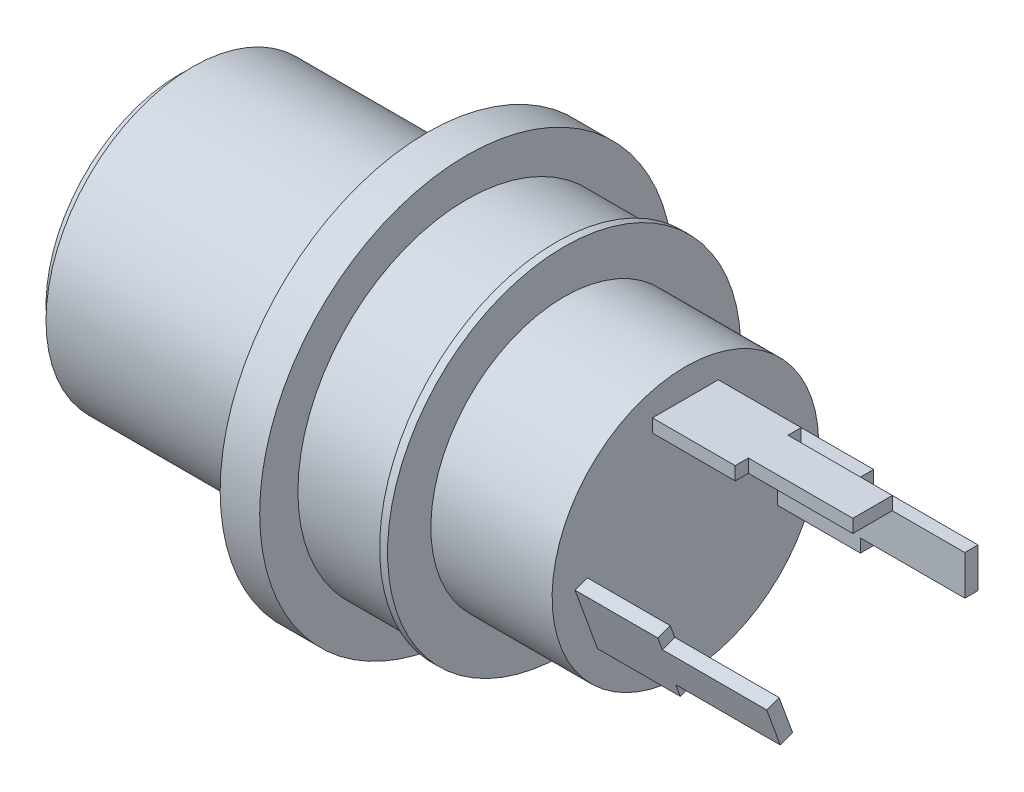
ISO-10303-21;
HEADER;
FILE_DESCRIPTION(('STEP AP214'),'2;1');
FILE_NAME('part.step','',(''),(''),'','','');
FILE_SCHEMA(('AUTOMOTIVE_DESIGN { 1 0 10303 214 1 1 1 1 }'));
ENDSEC;
DATA;
#1=APPLICATION_CONTEXT('core data for automotive mechanical design processes');
#2=APPLICATION_PROTOCOL_DEFINITION('international standard','automotive_design',2000,#1);
#3=PRODUCT_CONTEXT('',#1,'mechanical');
#4=PRODUCT('Part','Part','',(#3));
#5=PRODUCT_RELATED_PRODUCT_CATEGORY('part','',(#4));
#6=PRODUCT_DEFINITION_FORMATION('','',#4);
#7=PRODUCT_DEFINITION_CONTEXT('part definition',#1,'design');
#8=PRODUCT_DEFINITION('design','',#6,#7);
#9=PRODUCT_DEFINITION_SHAPE('','',#8);
#10=(LENGTH_UNIT() NAMED_UNIT(*) SI_UNIT(.MILLI.,.METRE.));
#11=(NAMED_UNIT(*) PLANE_ANGLE_UNIT() SI_UNIT($,.RADIAN.));
#12=(NAMED_UNIT(*) SI_UNIT($,.STERADIAN.) SOLID_ANGLE_UNIT());
#13=UNCERTAINTY_MEASURE_WITH_UNIT(LENGTH_MEASURE(1.E-05),#10,'distance_accuracy_value','');
#14=(GEOMETRIC_REPRESENTATION_CONTEXT(3) GLOBAL_UNCERTAINTY_ASSIGNED_CONTEXT((#13)) GLOBAL_UNIT_ASSIGNED_CONTEXT((#10,
#11,#12)) REPRESENTATION_CONTEXT('',''));
#15=CARTESIAN_POINT('',(0.,0.,0.));
#16=DIRECTION('',(0.,0.,1.));
#17=DIRECTION('',(1.,0.,0.));
#18=AXIS2_PLACEMENT_3D('',#15,#16,#17);
#19=CARTESIAN_POINT('',(36.2472739636741,4.,-1.25));
#20=DIRECTION('',(0.,0.,-1.));
#21=DIRECTION('',(-1.,0.,0.));
#22=AXIS2_PLACEMENT_3D('',#19,#20,#21);
#23=PLANE('',#22);
#24=DIRECTION('',(-1.,0.,0.));
#25=VECTOR('',#24,1.);
#26=CARTESIAN_POINT('',(36.2472739636741,4.,-1.25));
#27=LINE('',#26,#25);
#28=CARTESIAN_POINT('',(3.14,4.,-1.25));
#29=VERTEX_POINT('',#28);
#30=CARTESIAN_POINT('',(0.,4.,-1.25));
#31=VERTEX_POINT('',#30);
#32=EDGE_CURVE('E214',#29,#31,#27,.T.);
#33=ORIENTED_EDGE('',*,*,#32,.F.);
#34=DIRECTION('',(0.,1.,0.));
#35=VECTOR('',#34,1.);
#36=CARTESIAN_POINT('',(3.14,3.5,-1.25));
#37=LINE('',#36,#35);
#38=CARTESIAN_POINT('',(3.14,3.5,-1.25));
#39=VERTEX_POINT('',#38);
#40=EDGE_CURVE('E199',#39,#29,#37,.T.);
#41=ORIENTED_EDGE('',*,*,#40,.F.);
#42=DIRECTION('',(-1.,0.,0.));
#43=VECTOR('',#42,1.);
#44=CARTESIAN_POINT('',(36.2472739636741,3.5,-1.25));
#45=LINE('',#44,#43);
#46=CARTESIAN_POINT('',(0.,3.5,-1.25));
#47=VERTEX_POINT('',#46);
#48=EDGE_CURVE('E222',#39,#47,#45,.T.);
#49=ORIENTED_EDGE('',*,*,#48,.T.);
#50=DIRECTION('',(0.,-1.,0.));
#51=VECTOR('',#50,1.);
#52=CARTESIAN_POINT('',(0.,4.,-1.25));
#53=LINE('',#52,#51);
#54=EDGE_CURVE('E221',#31,#47,#53,.T.);
#55=ORIENTED_EDGE('',*,*,#54,.F.);
#56=EDGE_LOOP('',(#33,#41,#49,#55));
#57=FACE_BOUND('',#56,.T.);
#58=ADVANCED_FACE('F38',(#57),#23,.T.);
#59=CARTESIAN_POINT('',(36.2472739636741,3.5,1.25));
#60=DIRECTION('',(0.,0.,1.));
#61=DIRECTION('',(1.,0.,0.));
#62=AXIS2_PLACEMENT_3D('',#59,#60,#61);
#63=PLANE('',#62);
#64=DIRECTION('',(-1.,0.,0.));
#65=VECTOR('',#64,1.);
#66=CARTESIAN_POINT('',(36.2472739636741,3.5,1.25));
#67=LINE('',#66,#65);
#68=CARTESIAN_POINT('',(3.14,3.5,1.25));
#69=VERTEX_POINT('',#68);
#70=CARTESIAN_POINT('',(0.,3.5,1.25));
#71=VERTEX_POINT('',#70);
#72=EDGE_CURVE('E227',#69,#71,#67,.T.);
#73=ORIENTED_EDGE('',*,*,#72,.F.);
#74=DIRECTION('',(0.,-1.,0.));
#75=VECTOR('',#74,1.);
#76=CARTESIAN_POINT('',(3.14,4.,1.25));
#77=LINE('',#76,#75);
#78=CARTESIAN_POINT('',(3.14,4.,1.25));
#79=VERTEX_POINT('',#78);
#80=EDGE_CURVE('E457',#79,#69,#77,.T.);
#81=ORIENTED_EDGE('',*,*,#80,.F.);
#82=DIRECTION('',(-1.,0.,0.));
#83=VECTOR('',#82,1.);
#84=CARTESIAN_POINT('',(36.2472739636741,4.,1.25));
#85=LINE('',#84,#83);
#86=CARTESIAN_POINT('',(0.,4.,1.25));
#87=VERTEX_POINT('',#86);
#88=EDGE_CURVE('E223',#79,#87,#85,.T.);
#89=ORIENTED_EDGE('',*,*,#88,.T.);
#90=DIRECTION('',(0.,1.,0.));
#91=VECTOR('',#90,1.);
#92=CARTESIAN_POINT('',(0.,3.5,1.25));
#93=LINE('',#92,#91);
#94=EDGE_CURVE('E448',#71,#87,#93,.T.);
#95=ORIENTED_EDGE('',*,*,#94,.F.);
#96=EDGE_LOOP('',(#73,#81,#89,#95));
#97=FACE_BOUND('',#96,.T.);
#98=ADVANCED_FACE('F285',(#97),#63,.T.);
#99=CARTESIAN_POINT('',(36.2472739636741,1.25,-3.5));
#100=DIRECTION('',(0.,1.,0.));
#101=DIRECTION('',(-1.,0.,0.));
#102=AXIS2_PLACEMENT_3D('',#99,#100,#101);
#103=PLANE('',#102);
#104=DIRECTION('',(-1.,0.,0.));
#105=VECTOR('',#104,1.);
#106=CARTESIAN_POINT('',(36.2472739636741,1.25,-3.5));
#107=LINE('',#106,#105);
#108=CARTESIAN_POINT('',(3.14,1.25,-3.5));
#109=VERTEX_POINT('',#108);
#110=CARTESIAN_POINT('',(0.,1.25,-3.5));
#111=VERTEX_POINT('',#110);
#112=EDGE_CURVE('E433',#109,#111,#107,.T.);
#113=ORIENTED_EDGE('',*,*,#112,.F.);
#114=DIRECTION('',(0.,0.,1.));
#115=VECTOR('',#114,1.);
#116=CARTESIAN_POINT('',(3.14,1.25,-3.5));
#117=LINE('',#116,#115);
#118=CARTESIAN_POINT('',(3.14,1.25,-4.));
#119=VERTEX_POINT('',#118);
#120=EDGE_CURVE('E818',#119,#109,#117,.T.);
#121=ORIENTED_EDGE('',*,*,#120,.F.);
#122=DIRECTION('',(-1.,0.,0.));
#123=VECTOR('',#122,1.);
#124=CARTESIAN_POINT('',(36.2472739636741,1.25,-4.));
#125=LINE('',#124,#123);
#126=CARTESIAN_POINT('',(0.,1.25,-4.));
#127=VERTEX_POINT('',#126);
#128=EDGE_CURVE('E435',#119,#127,#125,.T.);
#129=ORIENTED_EDGE('',*,*,#128,.T.);
#130=DIRECTION('',(0.,0.,-1.));
#131=VECTOR('',#130,1.);
#132=CARTESIAN_POINT('',(0.,1.25,-3.5));
#133=LINE('',#132,#131);
#134=EDGE_CURVE('E430',#111,#127,#133,.T.);
#135=ORIENTED_EDGE('',*,*,#134,.F.);
#136=EDGE_LOOP('',(#113,#121,#129,#135));
#137=FACE_BOUND('',#136,.T.);
#138=ADVANCED_FACE('F290',(#137),#103,.T.);
#139=CARTESIAN_POINT('',(0.,5.05625,0.));
#140=DIRECTION('',(1.,0.,0.));
#141=DIRECTION('',(0.,1.,0.));
#142=AXIS2_PLACEMENT_3D('',#139,#140,#141);
#143=PLANE('',#142);
#144=CARTESIAN_POINT('',(0.,0.,0.));
#145=DIRECTION('',(1.,0.,0.));
#146=DIRECTION('',(0.,1.,0.));
#147=AXIS2_PLACEMENT_3D('',#144,#145,#146);
#148=CIRCLE('',#147,5.05625);
#149=CARTESIAN_POINT('',(0.,5.05625,0.));
#150=VERTEX_POINT('',#149);
#151=EDGE_CURVE('E238',#150,#150,#148,.T.);
#152=ORIENTED_EDGE('',*,*,#151,.T.);
#153=EDGE_LOOP('',(#152));
#154=FACE_BOUND('',#153,.T.);
#155=ORIENTED_EDGE('',*,*,#54,.T.);
#156=DIRECTION('',(0.,0.,-1.));
#157=VECTOR('',#156,1.);
#158=CARTESIAN_POINT('',(0.,3.5,1.25));
#159=LINE('',#158,#157);
#160=EDGE_CURVE('E424',#71,#47,#159,.T.);
#161=ORIENTED_EDGE('',*,*,#160,.F.);
#162=ORIENTED_EDGE('',*,*,#94,.T.);
#163=DIRECTION('',(0.,0.,-1.));
#164=VECTOR('',#163,1.);
#165=CARTESIAN_POINT('',(0.,4.,1.25));
#166=LINE('',#165,#164);
#167=EDGE_CURVE('E446',#87,#31,#166,.T.);
#168=ORIENTED_EDGE('',*,*,#167,.T.);
#169=EDGE_LOOP('',(#155,#161,#162,#168));
#170=FACE_BOUND('',#169,.T.);
#171=DIRECTION('',(0.,0.,1.));
#172=VECTOR('',#171,1.);
#173=CARTESIAN_POINT('',(0.,-1.25,-4.));
#174=LINE('',#173,#172);
#175=CARTESIAN_POINT('',(0.,-1.25,-4.));
#176=VERTEX_POINT('',#175);
#177=CARTESIAN_POINT('',(0.,-1.25,-3.5));
#178=VERTEX_POINT('',#177);
#179=EDGE_CURVE('E374',#176,#178,#174,.T.);
#180=ORIENTED_EDGE('',*,*,#179,.T.);
#181=DIRECTION('',(0.,1.,0.));
#182=VECTOR('',#181,1.);
#183=CARTESIAN_POINT('',(0.,1.25,-3.5));
#184=LINE('',#183,#182);
#185=EDGE_CURVE('E425',#111,#178,#184,.F.);
#186=ORIENTED_EDGE('',*,*,#185,.F.);
#187=ORIENTED_EDGE('',*,*,#134,.T.);
#188=DIRECTION('',(0.,1.,0.));
#189=VECTOR('',#188,1.);
#190=CARTESIAN_POINT('',(0.,1.25,-4.));
#191=LINE('',#190,#189);
#192=EDGE_CURVE('E428',#127,#176,#191,.F.);
#193=ORIENTED_EDGE('',*,*,#192,.T.);
#194=EDGE_LOOP('',(#180,#186,#187,#193));
#195=FACE_BOUND('',#194,.T.);
#196=DIRECTION('',(0.,-0.342020143325662,0.939692620785911));
#197=VECTOR('',#196,1.);
#198=CARTESIAN_POINT('',(0.,-2.37168627762221,2.86139899359361));
#199=LINE('',#198,#197);
#200=CARTESIAN_POINT('',(0.,-2.37168627762221,2.86139899359361));
#201=VERTEX_POINT('',#200);
#202=CARTESIAN_POINT('',(0.,-2.54269634928504,3.33124530398656));
#203=VERTEX_POINT('',#202);
#204=EDGE_CURVE('E380',#201,#203,#199,.T.);
#205=ORIENTED_EDGE('',*,*,#204,.T.);
#206=DIRECTION('',(0.,-0.939692620785911,-0.342020143325663));
#207=VECTOR('',#206,1.);
#208=CARTESIAN_POINT('',(0.,-0.193464797320264,4.18629566230072));
#209=LINE('',#208,#207);
#210=CARTESIAN_POINT('',(0.,-0.193464797320264,4.18629566230072));
#211=VERTEX_POINT('',#210);
#212=EDGE_CURVE('E383',#211,#203,#209,.T.);
#213=ORIENTED_EDGE('',*,*,#212,.F.);
#214=DIRECTION('',(0.,0.342020143325663,-0.939692620785911));
#215=VECTOR('',#214,1.);
#216=CARTESIAN_POINT('',(0.,-0.193464797320264,4.18629566230072));
#217=LINE('',#216,#215);
#218=CARTESIAN_POINT('',(0.,-0.0224547256574331,3.71644935190777));
#219=VERTEX_POINT('',#218);
#220=EDGE_CURVE('E408',#211,#219,#217,.T.);
#221=ORIENTED_EDGE('',*,*,#220,.T.);
#222=DIRECTION('',(0.,-0.939692620785911,-0.342020143325663));
#223=VECTOR('',#222,1.);
#224=CARTESIAN_POINT('',(0.,-0.0224547256574327,3.71644935190777));
#225=LINE('',#224,#223);
#226=EDGE_CURVE('E386',#219,#201,#225,.T.);
#227=ORIENTED_EDGE('',*,*,#226,.T.);
#228=EDGE_LOOP('',(#205,#213,#221,#227));
#229=FACE_BOUND('',#228,.T.);
#230=ADVANCED_FACE('F282',(#154,#170,#195,#229),#143,.T.);
#231=CARTESIAN_POINT('',(-19.2,0.,0.));
#232=DIRECTION('',(-1.,0.,0.));
#233=DIRECTION('',(0.,-1.,0.));
#234=AXIS2_PLACEMENT_3D('',#231,#232,#233);
#235=PLANE('',#234);
#236=CARTESIAN_POINT('',(-19.2,0.,0.));
#237=DIRECTION('',(-1.,0.,0.));
#238=DIRECTION('',(0.,-1.,0.));
#239=AXIS2_PLACEMENT_3D('',#236,#237,#238);
#240=CIRCLE('',#239,3.55625);
#241=CARTESIAN_POINT('',(-19.2,-3.55625,0.));
#242=VERTEX_POINT('',#241);
#243=EDGE_CURVE('E231',#242,#242,#240,.T.);
#244=ORIENTED_EDGE('',*,*,#243,.F.);
#245=EDGE_LOOP('',(#244));
#246=FACE_BOUND('',#245,.T.);
#247=CARTESIAN_POINT('',(-19.2,0.,0.));
#248=DIRECTION('',(1.,0.,0.));
#249=DIRECTION('',(0.,1.,0.));
#250=AXIS2_PLACEMENT_3D('',#247,#248,#249);
#251=CIRCLE('',#250,5.05625);
#252=CARTESIAN_POINT('',(-19.2,5.05625,0.));
#253=VERTEX_POINT('',#252);
#254=EDGE_CURVE('E13',#253,#253,#251,.T.);
#255=ORIENTED_EDGE('',*,*,#254,.F.);
#256=EDGE_LOOP('',(#255));
#257=FACE_BOUND('',#256,.T.);
#258=ADVANCED_FACE('F40',(#246,#257),#235,.T.);
#259=CARTESIAN_POINT('',(0.,0.,0.));
#260=DIRECTION('',(1.,0.,0.));
#261=DIRECTION('',(0.,1.,0.));
#262=AXIS2_PLACEMENT_3D('',#259,#260,#261);
#263=CYLINDRICAL_SURFACE('',#262,5.05625);
#264=ORIENTED_EDGE('',*,*,#254,.T.);
#265=EDGE_LOOP('',(#264));
#266=FACE_BOUND('',#265,.T.);
#267=CARTESIAN_POINT('',(-18.7,0.,0.));
#268=DIRECTION('',(1.,0.,0.));
#269=DIRECTION('',(0.,1.,0.));
#270=AXIS2_PLACEMENT_3D('',#267,#268,#269);
#271=CIRCLE('',#270,5.05625);
#272=CARTESIAN_POINT('',(-18.7,5.05625,0.));
#273=VERTEX_POINT('',#272);
#274=EDGE_CURVE('E46',#273,#273,#271,.T.);
#275=ORIENTED_EDGE('',*,*,#274,.F.);
#276=EDGE_LOOP('',(#275));
#277=FACE_BOUND('',#276,.T.);
#278=ADVANCED_FACE('F273',(#266,#277),#263,.T.);
#279=CARTESIAN_POINT('',(-18.7,5.05625,0.));
#280=DIRECTION('',(-1.,0.,0.));
#281=DIRECTION('',(0.,-1.,0.));
#282=AXIS2_PLACEMENT_3D('',#279,#280,#281);
#283=PLANE('',#282);
#284=ORIENTED_EDGE('',*,*,#274,.T.);
#285=EDGE_LOOP('',(#284));
#286=FACE_BOUND('',#285,.T.);
#287=CARTESIAN_POINT('',(-18.7,0.,0.));
#288=DIRECTION('',(1.,0.,0.));
#289=DIRECTION('',(0.,1.,0.));
#290=AXIS2_PLACEMENT_3D('',#287,#288,#289);
#291=CIRCLE('',#290,5.55625);
#292=CARTESIAN_POINT('',(-18.7,5.55625,0.));
#293=VERTEX_POINT('',#292);
#294=EDGE_CURVE('E265',#293,#293,#291,.T.);
#295=ORIENTED_EDGE('',*,*,#294,.F.);
#296=EDGE_LOOP('',(#295));
#297=FACE_BOUND('',#296,.T.);
#298=ADVANCED_FACE('F270',(#286,#297),#283,.T.);
#299=CARTESIAN_POINT('',(0.,0.,0.));
#300=DIRECTION('',(1.,0.,0.));
#301=DIRECTION('',(0.,1.,0.));
#302=AXIS2_PLACEMENT_3D('',#299,#300,#301);
#303=CYLINDRICAL_SURFACE('',#302,5.55625);
#304=ORIENTED_EDGE('',*,*,#294,.T.);
#305=EDGE_LOOP('',(#304));
#306=FACE_BOUND('',#305,.T.);
#307=CARTESIAN_POINT('',(-9.8,0.,0.));
#308=DIRECTION('',(1.,0.,0.));
#309=DIRECTION('',(0.,1.,0.));
#310=AXIS2_PLACEMENT_3D('',#307,#308,#309);
#311=CIRCLE('',#310,5.55625);
#312=CARTESIAN_POINT('',(-9.8,5.55625,0.));
#313=VERTEX_POINT('',#312);
#314=EDGE_CURVE('E262',#313,#313,#311,.T.);
#315=ORIENTED_EDGE('',*,*,#314,.F.);
#316=EDGE_LOOP('',(#315));
#317=FACE_BOUND('',#316,.T.);
#318=ADVANCED_FACE('F280',(#306,#317),#303,.T.);
#319=CARTESIAN_POINT('',(-9.8,5.55625,0.));
#320=DIRECTION('',(-1.,0.,0.));
#321=DIRECTION('',(0.,-1.,0.));
#322=AXIS2_PLACEMENT_3D('',#319,#320,#321);
#323=PLANE('',#322);
#324=ORIENTED_EDGE('',*,*,#314,.T.);
#325=EDGE_LOOP('',(#324));
#326=FACE_BOUND('',#325,.T.);
#327=CARTESIAN_POINT('',(-9.8,0.,0.));
#328=DIRECTION('',(1.,0.,0.));
#329=DIRECTION('',(0.,1.,0.));
#330=AXIS2_PLACEMENT_3D('',#327,#328,#329);
#331=CIRCLE('',#330,7.85);
#332=CARTESIAN_POINT('',(-9.8,7.85,0.));
#333=VERTEX_POINT('',#332);
#334=EDGE_CURVE('E259',#333,#333,#331,.T.);
#335=ORIENTED_EDGE('',*,*,#334,.F.);
#336=EDGE_LOOP('',(#335));
#337=FACE_BOUND('',#336,.T.);
#338=ADVANCED_FACE('F337',(#326,#337),#323,.T.);
#339=CARTESIAN_POINT('',(0.,0.,0.));
#340=DIRECTION('',(1.,0.,0.));
#341=DIRECTION('',(0.,1.,0.));
#342=AXIS2_PLACEMENT_3D('',#339,#340,#341);
#343=CYLINDRICAL_SURFACE('',#342,7.85);
#344=ORIENTED_EDGE('',*,*,#334,.T.);
#345=EDGE_LOOP('',(#344));
#346=FACE_BOUND('',#345,.T.);
#347=CARTESIAN_POINT('',(-8.3,0.,0.));
#348=DIRECTION('',(1.,0.,0.));
#349=DIRECTION('',(0.,1.,0.));
#350=AXIS2_PLACEMENT_3D('',#347,#348,#349);
#351=CIRCLE('',#350,7.85);
#352=CARTESIAN_POINT('',(-8.3,7.85,0.));
#353=VERTEX_POINT('',#352);
#354=EDGE_CURVE('E256',#353,#353,#351,.T.);
#355=ORIENTED_EDGE('',*,*,#354,.F.);
#356=EDGE_LOOP('',(#355));
#357=FACE_BOUND('',#356,.T.);
#358=ADVANCED_FACE('F333',(#346,#357),#343,.T.);
#359=CARTESIAN_POINT('',(-8.3,7.85,0.));
#360=DIRECTION('',(1.,0.,0.));
#361=DIRECTION('',(0.,1.,0.));
#362=AXIS2_PLACEMENT_3D('',#359,#360,#361);
#363=PLANE('',#362);
#364=ORIENTED_EDGE('',*,*,#354,.T.);
#365=EDGE_LOOP('',(#364));
#366=FACE_BOUND('',#365,.T.);
#367=CARTESIAN_POINT('',(-8.3,0.,0.));
#368=DIRECTION('',(1.,0.,0.));
#369=DIRECTION('',(0.,1.,0.));
#370=AXIS2_PLACEMENT_3D('',#367,#368,#369);
#371=CIRCLE('',#370,6.4);
#372=CARTESIAN_POINT('',(-8.3,6.4,0.));
#373=VERTEX_POINT('',#372);
#374=EDGE_CURVE('E253',#373,#373,#371,.T.);
#375=ORIENTED_EDGE('',*,*,#374,.F.);
#376=EDGE_LOOP('',(#375));
#377=FACE_BOUND('',#376,.T.);
#378=ADVANCED_FACE('F329',(#366,#377),#363,.T.);
#379=CARTESIAN_POINT('',(0.,0.,0.));
#380=DIRECTION('',(1.,0.,0.));
#381=DIRECTION('',(0.,1.,0.));
#382=AXIS2_PLACEMENT_3D('',#379,#380,#381);
#383=CYLINDRICAL_SURFACE('',#382,6.4);
#384=ORIENTED_EDGE('',*,*,#374,.T.);
#385=EDGE_LOOP('',(#384));
#386=FACE_BOUND('',#385,.T.);
#387=CARTESIAN_POINT('',(-4.9,0.,0.));
#388=DIRECTION('',(1.,0.,0.));
#389=DIRECTION('',(0.,1.,0.));
#390=AXIS2_PLACEMENT_3D('',#387,#388,#389);
#391=CIRCLE('',#390,6.4);
#392=CARTESIAN_POINT('',(-4.9,6.4,0.));
#393=VERTEX_POINT('',#392);
#394=EDGE_CURVE('E250',#393,#393,#391,.T.);
#395=ORIENTED_EDGE('',*,*,#394,.F.);
#396=EDGE_LOOP('',(#395));
#397=FACE_BOUND('',#396,.T.);
#398=ADVANCED_FACE('F325',(#386,#397),#383,.T.);
#399=CARTESIAN_POINT('',(-4.9,6.4,0.));
#400=DIRECTION('',(-1.,0.,0.));
#401=DIRECTION('',(0.,-1.,0.));
#402=AXIS2_PLACEMENT_3D('',#399,#400,#401);
#403=PLANE('',#402);
#404=ORIENTED_EDGE('',*,*,#394,.T.);
#405=EDGE_LOOP('',(#404));
#406=FACE_BOUND('',#405,.T.);
#407=CARTESIAN_POINT('',(-4.9,0.,0.));
#408=DIRECTION('',(1.,0.,0.));
#409=DIRECTION('',(0.,1.,0.));
#410=AXIS2_PLACEMENT_3D('',#407,#408,#409);
#411=CIRCLE('',#410,6.7);
#412=CARTESIAN_POINT('',(-4.9,6.7,0.));
#413=VERTEX_POINT('',#412);
#414=EDGE_CURVE('E247',#413,#413,#411,.T.);
#415=ORIENTED_EDGE('',*,*,#414,.F.);
#416=EDGE_LOOP('',(#415));
#417=FACE_BOUND('',#416,.T.);
#418=ADVANCED_FACE('F321',(#406,#417),#403,.T.);
#419=CARTESIAN_POINT('',(0.,0.,0.));
#420=DIRECTION('',(1.,0.,0.));
#421=DIRECTION('',(0.,1.,0.));
#422=AXIS2_PLACEMENT_3D('',#419,#420,#421);
#423=CYLINDRICAL_SURFACE('',#422,6.7);
#424=ORIENTED_EDGE('',*,*,#414,.T.);
#425=EDGE_LOOP('',(#424));
#426=FACE_BOUND('',#425,.T.);
#427=CARTESIAN_POINT('',(-4.6,0.,0.));
#428=DIRECTION('',(1.,0.,0.));
#429=DIRECTION('',(0.,1.,0.));
#430=AXIS2_PLACEMENT_3D('',#427,#428,#429);
#431=CIRCLE('',#430,6.7);
#432=CARTESIAN_POINT('',(-4.6,6.7,0.));
#433=VERTEX_POINT('',#432);
#434=EDGE_CURVE('E244',#433,#433,#431,.T.);
#435=ORIENTED_EDGE('',*,*,#434,.F.);
#436=EDGE_LOOP('',(#435));
#437=FACE_BOUND('',#436,.T.);
#438=ADVANCED_FACE('F317',(#426,#437),#423,.T.);
#439=CARTESIAN_POINT('',(-4.6,6.7,0.));
#440=DIRECTION('',(1.,0.,0.));
#441=DIRECTION('',(0.,1.,0.));
#442=AXIS2_PLACEMENT_3D('',#439,#440,#441);
#443=PLANE('',#442);
#444=ORIENTED_EDGE('',*,*,#434,.T.);
#445=EDGE_LOOP('',(#444));
#446=FACE_BOUND('',#445,.T.);
#447=CARTESIAN_POINT('',(-4.6,0.,0.));
#448=DIRECTION('',(1.,0.,0.));
#449=DIRECTION('',(0.,1.,0.));
#450=AXIS2_PLACEMENT_3D('',#447,#448,#449);
#451=CIRCLE('',#450,5.05625);
#452=CARTESIAN_POINT('',(-4.6,5.05625,0.));
#453=VERTEX_POINT('',#452);
#454=EDGE_CURVE('E241',#453,#453,#451,.T.);
#455=ORIENTED_EDGE('',*,*,#454,.F.);
#456=EDGE_LOOP('',(#455));
#457=FACE_BOUND('',#456,.T.);
#458=ADVANCED_FACE('F313',(#446,#457),#443,.T.);
#459=CARTESIAN_POINT('',(0.,0.,0.));
#460=DIRECTION('',(1.,0.,0.));
#461=DIRECTION('',(0.,1.,0.));
#462=AXIS2_PLACEMENT_3D('',#459,#460,#461);
#463=CYLINDRICAL_SURFACE('',#462,5.05625);
#464=ORIENTED_EDGE('',*,*,#454,.T.);
#465=EDGE_LOOP('',(#464));
#466=FACE_BOUND('',#465,.T.);
#467=ORIENTED_EDGE('',*,*,#151,.F.);
#468=EDGE_LOOP('',(#467));
#469=FACE_BOUND('',#468,.T.);
#470=ADVANCED_FACE('F306',(#466,#469),#463,.T.);
#471=CARTESIAN_POINT('',(0.258593962378643,0.,0.));
#472=DIRECTION('',(-1.,0.,0.));
#473=DIRECTION('',(0.,-1.,0.));
#474=AXIS2_PLACEMENT_3D('',#471,#472,#473);
#475=CYLINDRICAL_SURFACE('',#474,3.55625);
#476=CARTESIAN_POINT('',(-11.3,0.,0.));
#477=DIRECTION('',(-1.,0.,0.));
#478=DIRECTION('',(0.,-1.,0.));
#479=AXIS2_PLACEMENT_3D('',#476,#477,#478);
#480=CIRCLE('',#479,3.55625);
#481=CARTESIAN_POINT('',(-11.3,-3.55625,0.));
#482=VERTEX_POINT('',#481);
#483=EDGE_CURVE('E234',#482,#482,#480,.F.);
#484=ORIENTED_EDGE('',*,*,#483,.T.);
#485=EDGE_LOOP('',(#484));
#486=FACE_BOUND('',#485,.T.);
#487=ORIENTED_EDGE('',*,*,#243,.T.);
#488=EDGE_LOOP('',(#487));
#489=FACE_BOUND('',#488,.T.);
#490=ADVANCED_FACE('F302',(#486,#489),#475,.F.);
#491=CARTESIAN_POINT('',(-11.3,5.55625,0.));
#492=DIRECTION('',(-1.,0.,0.));
#493=DIRECTION('',(0.,-1.,0.));
#494=AXIS2_PLACEMENT_3D('',#491,#492,#493);
#495=PLANE('',#494);
#496=ORIENTED_EDGE('',*,*,#483,.F.);
#497=EDGE_LOOP('',(#496));
#498=FACE_BOUND('',#497,.T.);
#499=ADVANCED_FACE('F298',(#498),#495,.T.);
#500=CARTESIAN_POINT('',(36.2472739636741,3.5,1.25));
#501=DIRECTION('',(0.,1.,0.));
#502=DIRECTION('',(0.,0.,1.));
#503=AXIS2_PLACEMENT_3D('',#500,#501,#502);
#504=PLANE('',#503);
#505=DIRECTION('',(0.,0.,-1.));
#506=VECTOR('',#505,1.);
#507=CARTESIAN_POINT('',(3.14,3.5,-1.25));
#508=LINE('',#507,#506);
#509=CARTESIAN_POINT('',(3.14,3.5,-0.749999999999998));
#510=VERTEX_POINT('',#509);
#511=EDGE_CURVE('E205',#510,#39,#508,.T.);
#512=ORIENTED_EDGE('',*,*,#511,.F.);
#513=DIRECTION('',(1.,0.,0.));
#514=VECTOR('',#513,1.);
#515=CARTESIAN_POINT('',(3.14,3.5,-0.749999999999998));
#516=LINE('',#515,#514);
#517=CARTESIAN_POINT('',(7.1,3.5,-0.749999999999998));
#518=VERTEX_POINT('',#517);
#519=EDGE_CURVE('E469',#510,#518,#516,.T.);
#520=ORIENTED_EDGE('',*,*,#519,.T.);
#521=DIRECTION('',(0.,0.,1.));
#522=VECTOR('',#521,1.);
#523=CARTESIAN_POINT('',(7.1,3.5,1.25));
#524=LINE('',#523,#522);
#525=CARTESIAN_POINT('',(7.1,3.5,0.749999999999998));
#526=VERTEX_POINT('',#525);
#527=EDGE_CURVE('E235',#518,#526,#524,.T.);
#528=ORIENTED_EDGE('',*,*,#527,.T.);
#529=DIRECTION('',(1.,0.,0.));
#530=VECTOR('',#529,1.);
#531=CARTESIAN_POINT('',(3.14,3.5,0.749999999999998));
#532=LINE('',#531,#530);
#533=CARTESIAN_POINT('',(3.14,3.5,0.749999999999998));
#534=VERTEX_POINT('',#533);
#535=EDGE_CURVE('E53',#534,#526,#532,.T.);
#536=ORIENTED_EDGE('',*,*,#535,.F.);
#537=DIRECTION('',(0.,0.,-1.));
#538=VECTOR('',#537,1.);
#539=CARTESIAN_POINT('',(3.14,3.5,1.25));
#540=LINE('',#539,#538);
#541=EDGE_CURVE('E453',#69,#534,#540,.T.);
#542=ORIENTED_EDGE('',*,*,#541,.F.);
#543=ORIENTED_EDGE('',*,*,#72,.T.);
#544=ORIENTED_EDGE('',*,*,#160,.T.);
#545=ORIENTED_EDGE('',*,*,#48,.F.);
#546=EDGE_LOOP('',(#512,#520,#528,#536,#542,#543,#544,#545));
#547=FACE_BOUND('',#546,.T.);
#548=ADVANCED_FACE('F295',(#547),#504,.F.);
#549=CARTESIAN_POINT('',(36.2472739636741,4.,1.25));
#550=DIRECTION('',(0.,1.,0.));
#551=DIRECTION('',(0.,0.,1.));
#552=AXIS2_PLACEMENT_3D('',#549,#550,#551);
#553=PLANE('',#552);
#554=DIRECTION('',(1.,0.,0.));
#555=VECTOR('',#554,1.);
#556=CARTESIAN_POINT('',(3.14,4.,-0.749999999999998));
#557=LINE('',#556,#555);
#558=CARTESIAN_POINT('',(3.14,4.,-0.749999999999998));
#559=VERTEX_POINT('',#558);
#560=CARTESIAN_POINT('',(7.1,4.,-0.749999999999998));
#561=VERTEX_POINT('',#560);
#562=EDGE_CURVE('E61',#559,#561,#557,.T.);
#563=ORIENTED_EDGE('',*,*,#562,.F.);
#564=DIRECTION('',(0.,0.,1.));
#565=VECTOR('',#564,1.);
#566=CARTESIAN_POINT('',(3.14,4.,-1.25));
#567=LINE('',#566,#565);
#568=EDGE_CURVE('E203',#29,#559,#567,.T.);
#569=ORIENTED_EDGE('',*,*,#568,.F.);
#570=ORIENTED_EDGE('',*,*,#32,.T.);
#571=ORIENTED_EDGE('',*,*,#167,.F.);
#572=ORIENTED_EDGE('',*,*,#88,.F.);
#573=DIRECTION('',(0.,0.,1.));
#574=VECTOR('',#573,1.);
#575=CARTESIAN_POINT('',(3.14,4.,1.25));
#576=LINE('',#575,#574);
#577=CARTESIAN_POINT('',(3.14,4.,0.749999999999998));
#578=VERTEX_POINT('',#577);
#579=EDGE_CURVE('E459',#578,#79,#576,.T.);
#580=ORIENTED_EDGE('',*,*,#579,.F.);
#581=DIRECTION('',(1.,0.,0.));
#582=VECTOR('',#581,1.);
#583=CARTESIAN_POINT('',(3.14,4.,0.749999999999998));
#584=LINE('',#583,#582);
#585=CARTESIAN_POINT('',(7.1,4.,0.749999999999998));
#586=VERTEX_POINT('',#585);
#587=EDGE_CURVE('E399',#578,#586,#584,.T.);
#588=ORIENTED_EDGE('',*,*,#587,.T.);
#589=DIRECTION('',(0.,0.,1.));
#590=VECTOR('',#589,1.);
#591=CARTESIAN_POINT('',(7.1,4.,1.25));
#592=LINE('',#591,#590);
#593=EDGE_CURVE('E225',#561,#586,#592,.T.);
#594=ORIENTED_EDGE('',*,*,#593,.F.);
#595=EDGE_LOOP('',(#563,#569,#570,#571,#572,#580,#588,#594));
#596=FACE_BOUND('',#595,.T.);
#597=ADVANCED_FACE('F212',(#596),#553,.T.);
#598=CARTESIAN_POINT('',(7.1,0.,0.));
#599=DIRECTION('',(-1.,0.,0.));
#600=DIRECTION('',(0.,-1.,0.));
#601=AXIS2_PLACEMENT_3D('',#598,#599,#600);
#602=PLANE('',#601);
#603=ORIENTED_EDGE('',*,*,#527,.F.);
#604=DIRECTION('',(0.,-1.,0.));
#605=VECTOR('',#604,1.);
#606=CARTESIAN_POINT('',(7.1,3.5,-0.749999999999998));
#607=LINE('',#606,#605);
#608=EDGE_CURVE('E209',#561,#518,#607,.T.);
#609=ORIENTED_EDGE('',*,*,#608,.F.);
#610=ORIENTED_EDGE('',*,*,#593,.T.);
#611=DIRECTION('',(0.,1.,0.));
#612=VECTOR('',#611,1.);
#613=CARTESIAN_POINT('',(7.1,4.,0.749999999999998));
#614=LINE('',#613,#612);
#615=EDGE_CURVE('E468',#526,#586,#614,.T.);
#616=ORIENTED_EDGE('',*,*,#615,.F.);
#617=EDGE_LOOP('',(#603,#609,#610,#616));
#618=FACE_BOUND('',#617,.T.);
#619=ADVANCED_FACE('F500',(#618),#602,.F.);
#620=CARTESIAN_POINT('',(36.2472739636741,1.25,-3.5));
#621=DIRECTION('',(0.,0.,-1.));
#622=DIRECTION('',(-1.,0.,0.));
#623=AXIS2_PLACEMENT_3D('',#620,#621,#622);
#624=PLANE('',#623);
#625=DIRECTION('',(0.,-1.,0.));
#626=VECTOR('',#625,1.);
#627=CARTESIAN_POINT('',(3.14,-1.25,-3.5));
#628=LINE('',#627,#626);
#629=CARTESIAN_POINT('',(3.14,-0.749999999999998,-3.5));
#630=VERTEX_POINT('',#629);
#631=CARTESIAN_POINT('',(3.14,-1.25,-3.5));
#632=VERTEX_POINT('',#631);
#633=EDGE_CURVE('E823',#630,#632,#628,.T.);
#634=ORIENTED_EDGE('',*,*,#633,.F.);
#635=DIRECTION('',(1.,0.,0.));
#636=VECTOR('',#635,1.);
#637=CARTESIAN_POINT('',(3.14,-0.749999999999998,-3.5));
#638=LINE('',#637,#636);
#639=CARTESIAN_POINT('',(7.1,-0.749999999999997,-3.5));
#640=VERTEX_POINT('',#639);
#641=EDGE_CURVE('E820',#630,#640,#638,.T.);
#642=ORIENTED_EDGE('',*,*,#641,.T.);
#643=DIRECTION('',(0.,1.,0.));
#644=VECTOR('',#643,1.);
#645=CARTESIAN_POINT('',(7.1,1.25,-3.5));
#646=LINE('',#645,#644);
#647=CARTESIAN_POINT('',(7.1,0.749999999999999,-3.5));
#648=VERTEX_POINT('',#647);
#649=EDGE_CURVE('E420',#640,#648,#646,.T.);
#650=ORIENTED_EDGE('',*,*,#649,.T.);
#651=DIRECTION('',(1.,0.,0.));
#652=VECTOR('',#651,1.);
#653=CARTESIAN_POINT('',(3.14,0.749999999999999,-3.5));
#654=LINE('',#653,#652);
#655=CARTESIAN_POINT('',(3.14,0.749999999999999,-3.5));
#656=VERTEX_POINT('',#655);
#657=EDGE_CURVE('E802',#656,#648,#654,.T.);
#658=ORIENTED_EDGE('',*,*,#657,.F.);
#659=DIRECTION('',(0.,-1.,0.));
#660=VECTOR('',#659,1.);
#661=CARTESIAN_POINT('',(3.14,1.25,-3.5));
#662=LINE('',#661,#660);
#663=EDGE_CURVE('E809',#109,#656,#662,.T.);
#664=ORIENTED_EDGE('',*,*,#663,.F.);
#665=ORIENTED_EDGE('',*,*,#112,.T.);
#666=ORIENTED_EDGE('',*,*,#185,.T.);
#667=DIRECTION('',(-1.,0.,0.));
#668=VECTOR('',#667,1.);
#669=CARTESIAN_POINT('',(36.2472739636741,-1.25,-3.5));
#670=LINE('',#669,#668);
#671=EDGE_CURVE('E421',#632,#178,#670,.T.);
#672=ORIENTED_EDGE('',*,*,#671,.F.);
#673=EDGE_LOOP('',(#634,#642,#650,#658,#664,#665,#666,#672));
#674=FACE_BOUND('',#673,.T.);
#675=ADVANCED_FACE('F546',(#674),#624,.F.);
#676=CARTESIAN_POINT('',(36.2472739636741,-1.25,-4.));
#677=DIRECTION('',(0.,-1.,0.));
#678=DIRECTION('',(1.,0.,0.));
#679=AXIS2_PLACEMENT_3D('',#676,#677,#678);
#680=PLANE('',#679);
#681=DIRECTION('',(0.,0.,-1.));
#682=VECTOR('',#681,1.);
#683=CARTESIAN_POINT('',(3.14,-1.25,-3.5));
#684=LINE('',#683,#682);
#685=CARTESIAN_POINT('',(3.14,-1.25,-4.));
#686=VERTEX_POINT('',#685);
#687=EDGE_CURVE('E825',#632,#686,#684,.T.);
#688=ORIENTED_EDGE('',*,*,#687,.F.);
#689=ORIENTED_EDGE('',*,*,#671,.T.);
#690=ORIENTED_EDGE('',*,*,#179,.F.);
#691=DIRECTION('',(-1.,0.,0.));
#692=VECTOR('',#691,1.);
#693=CARTESIAN_POINT('',(36.2472739636741,-1.25,-4.));
#694=LINE('',#693,#692);
#695=EDGE_CURVE('E437',#686,#176,#694,.T.);
#696=ORIENTED_EDGE('',*,*,#695,.F.);
#697=EDGE_LOOP('',(#688,#689,#690,#696));
#698=FACE_BOUND('',#697,.T.);
#699=ADVANCED_FACE('F542',(#698),#680,.T.);
#700=CARTESIAN_POINT('',(36.2472739636741,1.25,-4.));
#701=DIRECTION('',(0.,0.,-1.));
#702=DIRECTION('',(-1.,0.,0.));
#703=AXIS2_PLACEMENT_3D('',#700,#701,#702);
#704=PLANE('',#703);
#705=DIRECTION('',(1.,0.,0.));
#706=VECTOR('',#705,1.);
#707=CARTESIAN_POINT('',(3.14,-0.749999999999998,-4.));
#708=LINE('',#707,#706);
#709=CARTESIAN_POINT('',(3.14,-0.749999999999998,-4.));
#710=VERTEX_POINT('',#709);
#711=CARTESIAN_POINT('',(7.1,-0.749999999999997,-4.));
#712=VERTEX_POINT('',#711);
#713=EDGE_CURVE('E833',#710,#712,#708,.T.);
#714=ORIENTED_EDGE('',*,*,#713,.F.);
#715=DIRECTION('',(0.,1.,0.));
#716=VECTOR('',#715,1.);
#717=CARTESIAN_POINT('',(3.14,-1.25,-4.));
#718=LINE('',#717,#716);
#719=EDGE_CURVE('E828',#686,#710,#718,.T.);
#720=ORIENTED_EDGE('',*,*,#719,.F.);
#721=ORIENTED_EDGE('',*,*,#695,.T.);
#722=ORIENTED_EDGE('',*,*,#192,.F.);
#723=ORIENTED_EDGE('',*,*,#128,.F.);
#724=DIRECTION('',(0.,1.,0.));
#725=VECTOR('',#724,1.);
#726=CARTESIAN_POINT('',(3.14,1.25,-4.));
#727=LINE('',#726,#725);
#728=CARTESIAN_POINT('',(3.14,0.749999999999999,-4.));
#729=VERTEX_POINT('',#728);
#730=EDGE_CURVE('E816',#729,#119,#727,.T.);
#731=ORIENTED_EDGE('',*,*,#730,.F.);
#732=DIRECTION('',(1.,0.,0.));
#733=VECTOR('',#732,1.);
#734=CARTESIAN_POINT('',(3.14,0.749999999999999,-4.));
#735=LINE('',#734,#733);
#736=CARTESIAN_POINT('',(7.1,0.749999999999999,-4.));
#737=VERTEX_POINT('',#736);
#738=EDGE_CURVE('E799',#729,#737,#735,.T.);
#739=ORIENTED_EDGE('',*,*,#738,.T.);
#740=DIRECTION('',(0.,1.,0.));
#741=VECTOR('',#740,1.);
#742=CARTESIAN_POINT('',(7.1,1.25,-4.));
#743=LINE('',#742,#741);
#744=EDGE_CURVE('E417',#712,#737,#743,.T.);
#745=ORIENTED_EDGE('',*,*,#744,.F.);
#746=EDGE_LOOP('',(#714,#720,#721,#722,#723,#731,#739,#745));
#747=FACE_BOUND('',#746,.T.);
#748=ADVANCED_FACE('F535',(#747),#704,.T.);
#749=CARTESIAN_POINT('',(7.1,0.,0.));
#750=DIRECTION('',(-1.,0.,0.));
#751=DIRECTION('',(0.,-1.,0.));
#752=AXIS2_PLACEMENT_3D('',#749,#750,#751);
#753=PLANE('',#752);
#754=ORIENTED_EDGE('',*,*,#649,.F.);
#755=DIRECTION('',(0.,0.,1.));
#756=VECTOR('',#755,1.);
#757=CARTESIAN_POINT('',(7.1,-0.749999999999997,-3.5));
#758=LINE('',#757,#756);
#759=EDGE_CURVE('E826',#712,#640,#758,.T.);
#760=ORIENTED_EDGE('',*,*,#759,.F.);
#761=ORIENTED_EDGE('',*,*,#744,.T.);
#762=DIRECTION('',(0.,0.,-1.));
#763=VECTOR('',#762,1.);
#764=CARTESIAN_POINT('',(7.1,0.749999999999999,-3.5));
#765=LINE('',#764,#763);
#766=EDGE_CURVE('E813',#648,#737,#765,.T.);
#767=ORIENTED_EDGE('',*,*,#766,.F.);
#768=EDGE_LOOP('',(#754,#760,#761,#767));
#769=FACE_BOUND('',#768,.T.);
#770=ADVANCED_FACE('F532',(#769),#753,.F.);
#771=CARTESIAN_POINT('',(36.2472739636741,-0.19346479732026,4.18629566230072));
#772=DIRECTION('',(0.,0.342020143325663,-0.939692620785911));
#773=DIRECTION('',(0.,0.939692620785911,0.342020143325663));
#774=AXIS2_PLACEMENT_3D('',#771,#772,#773);
#775=PLANE('',#774);
#776=DIRECTION('',(0.,0.939692620785911,0.342020143325663));
#777=VECTOR('',#776,1.);
#778=CARTESIAN_POINT('',(7.1,-0.193464797320263,4.18629566230072));
#779=LINE('',#778,#777);
#780=CARTESIAN_POINT('',(7.1,-2.07285003889207,3.5022553756494));
#781=VERTEX_POINT('',#780);
#782=CARTESIAN_POINT('',(7.1,-0.663311107713211,4.01528559063789));
#783=VERTEX_POINT('',#782);
#784=EDGE_CURVE('E404',#781,#783,#779,.T.);
#785=ORIENTED_EDGE('',*,*,#784,.T.);
#786=DIRECTION('',(1.,0.,0.));
#787=VECTOR('',#786,1.);
#788=CARTESIAN_POINT('',(3.14,-0.663311107713211,4.01528559063789));
#789=LINE('',#788,#787);
#790=CARTESIAN_POINT('',(3.14,-0.663311107713211,4.01528559063789));
#791=VERTEX_POINT('',#790);
#792=EDGE_CURVE('E478',#791,#783,#789,.T.);
#793=ORIENTED_EDGE('',*,*,#792,.F.);
#794=DIRECTION('',(0.,-0.939692620785911,-0.342020143325661));
#795=VECTOR('',#794,1.);
#796=CARTESIAN_POINT('',(3.14,-0.193464797320264,4.18629566230072));
#797=LINE('',#796,#795);
#798=CARTESIAN_POINT('',(3.14,-0.193464797320264,4.18629566230072));
#799=VERTEX_POINT('',#798);
#800=EDGE_CURVE('E851',#799,#791,#797,.T.);
#801=ORIENTED_EDGE('',*,*,#800,.F.);
#802=DIRECTION('',(-1.,0.,0.));
#803=VECTOR('',#802,1.);
#804=CARTESIAN_POINT('',(36.2472739636741,-0.19346479732026,4.18629566230072));
#805=LINE('',#804,#803);
#806=EDGE_CURVE('E398',#799,#211,#805,.T.);
#807=ORIENTED_EDGE('',*,*,#806,.T.);
#808=ORIENTED_EDGE('',*,*,#212,.T.);
#809=DIRECTION('',(-1.,0.,0.));
#810=VECTOR('',#809,1.);
#811=CARTESIAN_POINT('',(36.2472739636741,-2.54269634928504,3.33124530398656));
#812=LINE('',#811,#810);
#813=CARTESIAN_POINT('',(3.14,-2.54269634928504,3.33124530398656));
#814=VERTEX_POINT('',#813);
#815=EDGE_CURVE('E395',#814,#203,#812,.T.);
#816=ORIENTED_EDGE('',*,*,#815,.F.);
#817=DIRECTION('',(0.,-0.939692620785911,-0.342020143325661));
#818=VECTOR('',#817,1.);
#819=CARTESIAN_POINT('',(3.14,-2.54269634928504,3.33124530398656));
#820=LINE('',#819,#818);
#821=CARTESIAN_POINT('',(3.14,-2.07285003889207,3.5022553756494));
#822=VERTEX_POINT('',#821);
#823=EDGE_CURVE('E838',#822,#814,#820,.T.);
#824=ORIENTED_EDGE('',*,*,#823,.F.);
#825=DIRECTION('',(1.,0.,0.));
#826=VECTOR('',#825,1.);
#827=CARTESIAN_POINT('',(3.14,-2.07285003889207,3.5022553756494));
#828=LINE('',#827,#826);
#829=EDGE_CURVE('E479',#822,#781,#828,.T.);
#830=ORIENTED_EDGE('',*,*,#829,.T.);
#831=EDGE_LOOP('',(#785,#793,#801,#807,#808,#816,#824,#830));
#832=FACE_BOUND('',#831,.T.);
#833=ADVANCED_FACE('F393',(#832),#775,.F.);
#834=CARTESIAN_POINT('',(36.2472739636741,-2.37168627762221,2.86139899359361));
#835=DIRECTION('',(0.,-0.939692620785911,-0.342020143325662));
#836=DIRECTION('',(0.,0.342020143325662,-0.939692620785911));
#837=AXIS2_PLACEMENT_3D('',#834,#835,#836);
#838=PLANE('',#837);
#839=DIRECTION('',(0.,0.34202014332566,-0.939692620785911));
#840=VECTOR('',#839,1.);
#841=CARTESIAN_POINT('',(3.14,-2.54269634928504,3.33124530398656));
#842=LINE('',#841,#840);
#843=CARTESIAN_POINT('',(3.14,-2.37168627762221,2.86139899359361));
#844=VERTEX_POINT('',#843);
#845=EDGE_CURVE('E840',#814,#844,#842,.T.);
#846=ORIENTED_EDGE('',*,*,#845,.F.);
#847=ORIENTED_EDGE('',*,*,#815,.T.);
#848=ORIENTED_EDGE('',*,*,#204,.F.);
#849=DIRECTION('',(-1.,0.,0.));
#850=VECTOR('',#849,1.);
#851=CARTESIAN_POINT('',(36.2472739636741,-2.37168627762221,2.86139899359361));
#852=LINE('',#851,#850);
#853=EDGE_CURVE('E413',#844,#201,#852,.T.);
#854=ORIENTED_EDGE('',*,*,#853,.F.);
#855=EDGE_LOOP('',(#846,#847,#848,#854));
#856=FACE_BOUND('',#855,.T.);
#857=ADVANCED_FACE('F526',(#856),#838,.T.);
#858=CARTESIAN_POINT('',(36.2472739636741,-0.0224547256574283,3.71644935190777));
#859=DIRECTION('',(0.,0.342020143325663,-0.939692620785911));
#860=DIRECTION('',(0.,0.939692620785911,0.342020143325663));
#861=AXIS2_PLACEMENT_3D('',#858,#859,#860);
#862=PLANE('',#861);
#863=DIRECTION('',(1.,0.,0.));
#864=VECTOR('',#863,1.);
#865=CARTESIAN_POINT('',(3.14,-0.492301036050381,3.54543928024494));
#866=LINE('',#865,#864);
#867=CARTESIAN_POINT('',(3.14,-0.492301036050381,3.54543928024494));
#868=VERTEX_POINT('',#867);
#869=CARTESIAN_POINT('',(7.1,-0.492301036050381,3.54543928024494));
#870=VERTEX_POINT('',#869);
#871=EDGE_CURVE('E493',#868,#870,#866,.T.);
#872=ORIENTED_EDGE('',*,*,#871,.T.);
#873=DIRECTION('',(0.,0.939692620785911,0.342020143325663));
#874=VECTOR('',#873,1.);
#875=CARTESIAN_POINT('',(7.1,-0.0224547256574318,3.71644935190777));
#876=LINE('',#875,#874);
#877=CARTESIAN_POINT('',(7.1,-1.90183996722924,3.03240906525644));
#878=VERTEX_POINT('',#877);
#879=EDGE_CURVE('E416',#878,#870,#876,.T.);
#880=ORIENTED_EDGE('',*,*,#879,.F.);
#881=DIRECTION('',(1.,0.,0.));
#882=VECTOR('',#881,1.);
#883=CARTESIAN_POINT('',(3.14,-1.90183996722924,3.03240906525644));
#884=LINE('',#883,#882);
#885=CARTESIAN_POINT('',(3.14,-1.90183996722924,3.03240906525644));
#886=VERTEX_POINT('',#885);
#887=EDGE_CURVE('E847',#886,#878,#884,.T.);
#888=ORIENTED_EDGE('',*,*,#887,.F.);
#889=DIRECTION('',(0.,0.939692620785911,0.342020143325661));
#890=VECTOR('',#889,1.);
#891=CARTESIAN_POINT('',(3.14,-2.37168627762221,2.86139899359361));
#892=LINE('',#891,#890);
#893=EDGE_CURVE('E842',#844,#886,#892,.T.);
#894=ORIENTED_EDGE('',*,*,#893,.F.);
#895=ORIENTED_EDGE('',*,*,#853,.T.);
#896=ORIENTED_EDGE('',*,*,#226,.F.);
#897=DIRECTION('',(-1.,0.,0.));
#898=VECTOR('',#897,1.);
#899=CARTESIAN_POINT('',(36.2472739636741,-0.0224547256574283,3.71644935190777));
#900=LINE('',#899,#898);
#901=CARTESIAN_POINT('',(3.14,-0.0224547256574327,3.71644935190777));
#902=VERTEX_POINT('',#901);
#903=EDGE_CURVE('E411',#902,#219,#900,.T.);
#904=ORIENTED_EDGE('',*,*,#903,.F.);
#905=DIRECTION('',(0.,0.939692620785911,0.342020143325661));
#906=VECTOR('',#905,1.);
#907=CARTESIAN_POINT('',(3.14,-0.0224547256574327,3.71644935190777));
#908=LINE('',#907,#906);
#909=EDGE_CURVE('E485',#868,#902,#908,.T.);
#910=ORIENTED_EDGE('',*,*,#909,.F.);
#911=EDGE_LOOP('',(#872,#880,#888,#894,#895,#896,#904,#910));
#912=FACE_BOUND('',#911,.T.);
#913=ADVANCED_FACE('F522',(#912),#862,.T.);
#914=CARTESIAN_POINT('',(36.2472739636741,-0.19346479732026,4.18629566230072));
#915=DIRECTION('',(0.,0.93969262078591,0.342020143325663));
#916=DIRECTION('',(0.,-0.342020143325663,0.939692620785911));
#917=AXIS2_PLACEMENT_3D('',#914,#915,#916);
#918=PLANE('',#917);
#919=DIRECTION('',(0.,-0.342020143325663,0.939692620785911));
#920=VECTOR('',#919,1.);
#921=CARTESIAN_POINT('',(3.14,-0.0224547256574327,3.71644935190777));
#922=LINE('',#921,#920);
#923=EDGE_CURVE('E487',#902,#799,#922,.T.);
#924=ORIENTED_EDGE('',*,*,#923,.F.);
#925=ORIENTED_EDGE('',*,*,#903,.T.);
#926=ORIENTED_EDGE('',*,*,#220,.F.);
#927=ORIENTED_EDGE('',*,*,#806,.F.);
#928=EDGE_LOOP('',(#924,#925,#926,#927));
#929=FACE_BOUND('',#928,.T.);
#930=ADVANCED_FACE('F519',(#929),#918,.T.);
#931=CARTESIAN_POINT('',(7.1,0.,0.));
#932=DIRECTION('',(-1.,0.,0.));
#933=DIRECTION('',(0.,-1.,0.));
#934=AXIS2_PLACEMENT_3D('',#931,#932,#933);
#935=PLANE('',#934);
#936=ORIENTED_EDGE('',*,*,#879,.T.);
#937=DIRECTION('',(0.,0.34202014332566,-0.939692620785912));
#938=VECTOR('',#937,1.);
#939=CARTESIAN_POINT('',(7.1,-0.492301036050381,3.54543928024494));
#940=LINE('',#939,#938);
#941=EDGE_CURVE('E482',#783,#870,#940,.T.);
#942=ORIENTED_EDGE('',*,*,#941,.F.);
#943=ORIENTED_EDGE('',*,*,#784,.F.);
#944=DIRECTION('',(0.,-0.34202014332566,0.939692620785911));
#945=VECTOR('',#944,1.);
#946=CARTESIAN_POINT('',(7.1,-2.07285003889207,3.5022553756494));
#947=LINE('',#946,#945);
#948=EDGE_CURVE('E481',#878,#781,#947,.T.);
#949=ORIENTED_EDGE('',*,*,#948,.F.);
#950=EDGE_LOOP('',(#936,#942,#943,#949));
#951=FACE_BOUND('',#950,.T.);
#952=ADVANCED_FACE('F480',(#951),#935,.F.);
#953=CARTESIAN_POINT('',(3.14,-2.07285003889207,3.5022553756494));
#954=DIRECTION('',(0.,0.939692620785912,0.34202014332566));
#955=DIRECTION('',(0.,-0.34202014332566,0.939692620785912));
#956=AXIS2_PLACEMENT_3D('',#953,#954,#955);
#957=PLANE('',#956);
#958=ORIENTED_EDGE('',*,*,#948,.T.);
#959=ORIENTED_EDGE('',*,*,#829,.F.);
#960=DIRECTION('',(0.,-0.34202014332566,0.939692620785911));
#961=VECTOR('',#960,1.);
#962=CARTESIAN_POINT('',(3.14,-2.07285003889207,3.5022553756494));
#963=LINE('',#962,#961);
#964=EDGE_CURVE('E844',#886,#822,#963,.T.);
#965=ORIENTED_EDGE('',*,*,#964,.F.);
#966=ORIENTED_EDGE('',*,*,#887,.T.);
#967=EDGE_LOOP('',(#958,#959,#965,#966));
#968=FACE_BOUND('',#967,.T.);
#969=ADVANCED_FACE('F518',(#968),#957,.F.);
#970=CARTESIAN_POINT('',(3.14,0.,0.));
#971=DIRECTION('',(-1.,0.,0.));
#972=DIRECTION('',(0.,0.,1.));
#973=AXIS2_PLACEMENT_3D('',#970,#971,#972);
#974=PLANE('',#973);
#975=ORIENTED_EDGE('',*,*,#823,.T.);
#976=ORIENTED_EDGE('',*,*,#845,.T.);
#977=ORIENTED_EDGE('',*,*,#893,.T.);
#978=ORIENTED_EDGE('',*,*,#964,.T.);
#979=EDGE_LOOP('',(#975,#976,#977,#978));
#980=FACE_BOUND('',#979,.T.);
#981=ADVANCED_FACE('F715',(#980),#974,.F.);
#982=CARTESIAN_POINT('',(3.14,-0.492301036050381,3.54543928024494));
#983=DIRECTION('',(0.,-0.939692620785912,-0.34202014332566));
#984=DIRECTION('',(0.,0.34202014332566,-0.939692620785912));
#985=AXIS2_PLACEMENT_3D('',#982,#983,#984);
#986=PLANE('',#985);
#987=ORIENTED_EDGE('',*,*,#941,.T.);
#988=ORIENTED_EDGE('',*,*,#871,.F.);
#989=DIRECTION('',(0.,0.34202014332566,-0.939692620785912));
#990=VECTOR('',#989,1.);
#991=CARTESIAN_POINT('',(3.14,-0.492301036050381,3.54543928024494));
#992=LINE('',#991,#990);
#993=EDGE_CURVE('E491',#791,#868,#992,.T.);
#994=ORIENTED_EDGE('',*,*,#993,.F.);
#995=ORIENTED_EDGE('',*,*,#792,.T.);
#996=EDGE_LOOP('',(#987,#988,#994,#995));
#997=FACE_BOUND('',#996,.T.);
#998=ADVANCED_FACE('F724',(#997),#986,.F.);
#999=CARTESIAN_POINT('',(3.14,0.,0.));
#1000=DIRECTION('',(-1.,0.,0.));
#1001=DIRECTION('',(0.,0.,1.));
#1002=AXIS2_PLACEMENT_3D('',#999,#1000,#1001);
#1003=PLANE('',#1002);
#1004=ORIENTED_EDGE('',*,*,#909,.T.);
#1005=ORIENTED_EDGE('',*,*,#923,.T.);
#1006=ORIENTED_EDGE('',*,*,#800,.T.);
#1007=ORIENTED_EDGE('',*,*,#993,.T.);
#1008=EDGE_LOOP('',(#1004,#1005,#1006,#1007));
#1009=FACE_BOUND('',#1008,.T.);
#1010=ADVANCED_FACE('F733',(#1009),#1003,.F.);
#1011=CARTESIAN_POINT('',(3.14,0.749999999999999,-3.5));
#1012=DIRECTION('',(0.,-1.,0.));
#1013=DIRECTION('',(1.,0.,0.));
#1014=AXIS2_PLACEMENT_3D('',#1011,#1012,#1013);
#1015=PLANE('',#1014);
#1016=ORIENTED_EDGE('',*,*,#766,.T.);
#1017=ORIENTED_EDGE('',*,*,#738,.F.);
#1018=DIRECTION('',(0.,0.,-1.));
#1019=VECTOR('',#1018,1.);
#1020=CARTESIAN_POINT('',(3.14,0.749999999999999,-3.5));
#1021=LINE('',#1020,#1019);
#1022=EDGE_CURVE('E812',#656,#729,#1021,.T.);
#1023=ORIENTED_EDGE('',*,*,#1022,.F.);
#1024=ORIENTED_EDGE('',*,*,#657,.T.);
#1025=EDGE_LOOP('',(#1016,#1017,#1023,#1024));
#1026=FACE_BOUND('',#1025,.T.);
#1027=ADVANCED_FACE('F740',(#1026),#1015,.F.);
#1028=CARTESIAN_POINT('',(3.14,0.,0.));
#1029=DIRECTION('',(1.,0.,0.));
#1030=DIRECTION('',(0.,0.,-1.));
#1031=AXIS2_PLACEMENT_3D('',#1028,#1029,#1030);
#1032=PLANE('',#1031);
#1033=ORIENTED_EDGE('',*,*,#663,.T.);
#1034=ORIENTED_EDGE('',*,*,#1022,.T.);
#1035=ORIENTED_EDGE('',*,*,#730,.T.);
#1036=ORIENTED_EDGE('',*,*,#120,.T.);
#1037=EDGE_LOOP('',(#1033,#1034,#1035,#1036));
#1038=FACE_BOUND('',#1037,.T.);
#1039=ADVANCED_FACE('F749',(#1038),#1032,.T.);
#1040=CARTESIAN_POINT('',(3.14,-0.749999999999998,-3.5));
#1041=DIRECTION('',(0.,1.,0.));
#1042=DIRECTION('',(-1.,0.,0.));
#1043=AXIS2_PLACEMENT_3D('',#1040,#1041,#1042);
#1044=PLANE('',#1043);
#1045=ORIENTED_EDGE('',*,*,#759,.T.);
#1046=ORIENTED_EDGE('',*,*,#641,.F.);
#1047=DIRECTION('',(0.,0.,1.));
#1048=VECTOR('',#1047,1.);
#1049=CARTESIAN_POINT('',(3.14,-0.749999999999998,-3.5));
#1050=LINE('',#1049,#1048);
#1051=EDGE_CURVE('E830',#710,#630,#1050,.T.);
#1052=ORIENTED_EDGE('',*,*,#1051,.F.);
#1053=ORIENTED_EDGE('',*,*,#713,.T.);
#1054=EDGE_LOOP('',(#1045,#1046,#1052,#1053));
#1055=FACE_BOUND('',#1054,.T.);
#1056=ADVANCED_FACE('F511',(#1055),#1044,.F.);
#1057=CARTESIAN_POINT('',(3.14,0.,0.));
#1058=DIRECTION('',(-1.,0.,0.));
#1059=DIRECTION('',(0.,0.,1.));
#1060=AXIS2_PLACEMENT_3D('',#1057,#1058,#1059);
#1061=PLANE('',#1060);
#1062=ORIENTED_EDGE('',*,*,#633,.T.);
#1063=ORIENTED_EDGE('',*,*,#687,.T.);
#1064=ORIENTED_EDGE('',*,*,#719,.T.);
#1065=ORIENTED_EDGE('',*,*,#1051,.T.);
#1066=EDGE_LOOP('',(#1062,#1063,#1064,#1065));
#1067=FACE_BOUND('',#1066,.T.);
#1068=ADVANCED_FACE('F503',(#1067),#1061,.F.);
#1069=CARTESIAN_POINT('',(3.14,4.,0.749999999999998));
#1070=DIRECTION('',(0.,0.,-1.));
#1071=DIRECTION('',(-1.,0.,0.));
#1072=AXIS2_PLACEMENT_3D('',#1069,#1070,#1071);
#1073=PLANE('',#1072);
#1074=ORIENTED_EDGE('',*,*,#615,.T.);
#1075=ORIENTED_EDGE('',*,*,#587,.F.);
#1076=DIRECTION('',(0.,1.,0.));
#1077=VECTOR('',#1076,1.);
#1078=CARTESIAN_POINT('',(3.14,4.,0.749999999999998));
#1079=LINE('',#1078,#1077);
#1080=EDGE_CURVE('E462',#534,#578,#1079,.T.);
#1081=ORIENTED_EDGE('',*,*,#1080,.F.);
#1082=ORIENTED_EDGE('',*,*,#535,.T.);
#1083=EDGE_LOOP('',(#1074,#1075,#1081,#1082));
#1084=FACE_BOUND('',#1083,.T.);
#1085=ADVANCED_FACE('F501',(#1084),#1073,.F.);
#1086=CARTESIAN_POINT('',(3.14,0.,0.));
#1087=DIRECTION('',(1.,0.,0.));
#1088=DIRECTION('',(0.,1.,0.));
#1089=AXIS2_PLACEMENT_3D('',#1086,#1087,#1088);
#1090=PLANE('',#1089);
#1091=ORIENTED_EDGE('',*,*,#80,.T.);
#1092=ORIENTED_EDGE('',*,*,#541,.T.);
#1093=ORIENTED_EDGE('',*,*,#1080,.T.);
#1094=ORIENTED_EDGE('',*,*,#579,.T.);
#1095=EDGE_LOOP('',(#1091,#1092,#1093,#1094));
#1096=FACE_BOUND('',#1095,.T.);
#1097=ADVANCED_FACE('F496',(#1096),#1090,.T.);
#1098=CARTESIAN_POINT('',(3.14,3.5,-0.749999999999998));
#1099=DIRECTION('',(0.,0.,1.));
#1100=DIRECTION('',(1.,0.,0.));
#1101=AXIS2_PLACEMENT_3D('',#1098,#1099,#1100);
#1102=PLANE('',#1101);
#1103=ORIENTED_EDGE('',*,*,#608,.T.);
#1104=ORIENTED_EDGE('',*,*,#519,.F.);
#1105=DIRECTION('',(0.,-1.,0.));
#1106=VECTOR('',#1105,1.);
#1107=CARTESIAN_POINT('',(3.14,3.5,-0.749999999999998));
#1108=LINE('',#1107,#1106);
#1109=EDGE_CURVE('E217',#559,#510,#1108,.T.);
#1110=ORIENTED_EDGE('',*,*,#1109,.F.);
#1111=ORIENTED_EDGE('',*,*,#562,.T.);
#1112=EDGE_LOOP('',(#1103,#1104,#1110,#1111));
#1113=FACE_BOUND('',#1112,.T.);
#1114=ADVANCED_FACE('F509',(#1113),#1102,.F.);
#1115=CARTESIAN_POINT('',(3.14,0.,0.));
#1116=DIRECTION('',(1.,0.,0.));
#1117=DIRECTION('',(0.,1.,0.));
#1118=AXIS2_PLACEMENT_3D('',#1115,#1116,#1117);
#1119=PLANE('',#1118);
#1120=ORIENTED_EDGE('',*,*,#40,.T.);
#1121=ORIENTED_EDGE('',*,*,#568,.T.);
#1122=ORIENTED_EDGE('',*,*,#1109,.T.);
#1123=ORIENTED_EDGE('',*,*,#511,.T.);
#1124=EDGE_LOOP('',(#1120,#1121,#1122,#1123));
#1125=FACE_BOUND('',#1124,.T.);
#1126=ADVANCED_FACE('F201',(#1125),#1119,.T.);
#1127=CLOSED_SHELL('',(#58,#98,#138,#230,#258,#278,#298,#318,#338,#358,#378,#398,#418,#438,#458,
#470,#490,#499,#548,#597,#619,#675,#699,#748,#770,#833,#857,#913,#930,#952,#969,#981,#998,#1010,
#1027,#1039,#1056,#1068,#1085,#1097,#1114,#1126));
#1128=MANIFOLD_SOLID_BREP('B2',#1127);
#1129=ADVANCED_BREP_SHAPE_REPRESENTATION('',(#18,#1128),#14);
#1130=SHAPE_DEFINITION_REPRESENTATION(#9,#1129);
ENDSEC;
END-ISO-10303-21;
